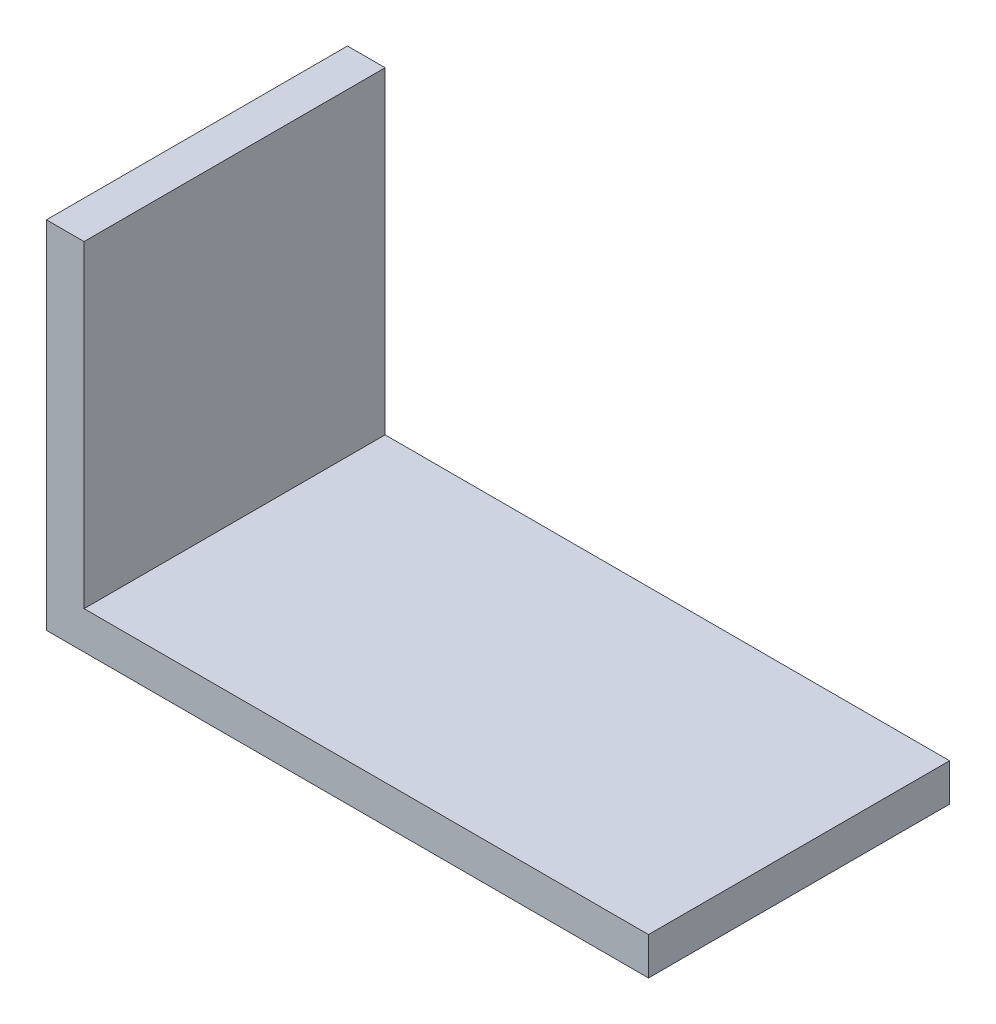
ISO-10303-21;
HEADER;
FILE_DESCRIPTION(('STEP AP214'),'2;1');
FILE_NAME('part.step','',(''),(''),'','','');
FILE_SCHEMA(('AUTOMOTIVE_DESIGN { 1 0 10303 214 1 1 1 1 }'));
ENDSEC;
DATA;
#1=APPLICATION_CONTEXT('core data for automotive mechanical design processes');
#2=APPLICATION_PROTOCOL_DEFINITION('international standard','automotive_design',2000,#1);
#3=PRODUCT_CONTEXT('',#1,'mechanical');
#4=PRODUCT('Part','Part','',(#3));
#5=PRODUCT_RELATED_PRODUCT_CATEGORY('part','',(#4));
#6=PRODUCT_DEFINITION_FORMATION('','',#4);
#7=PRODUCT_DEFINITION_CONTEXT('part definition',#1,'design');
#8=PRODUCT_DEFINITION('design','',#6,#7);
#9=PRODUCT_DEFINITION_SHAPE('','',#8);
#10=(LENGTH_UNIT() NAMED_UNIT(*) SI_UNIT(.MILLI.,.METRE.));
#11=(NAMED_UNIT(*) PLANE_ANGLE_UNIT() SI_UNIT($,.RADIAN.));
#12=(NAMED_UNIT(*) SI_UNIT($,.STERADIAN.) SOLID_ANGLE_UNIT());
#13=UNCERTAINTY_MEASURE_WITH_UNIT(LENGTH_MEASURE(1.E-05),#10,'distance_accuracy_value','');
#14=(GEOMETRIC_REPRESENTATION_CONTEXT(3) GLOBAL_UNCERTAINTY_ASSIGNED_CONTEXT((#13)) GLOBAL_UNIT_ASSIGNED_CONTEXT((#10,
#11,#12)) REPRESENTATION_CONTEXT('',''));
#15=CARTESIAN_POINT('',(0.,0.,0.));
#16=DIRECTION('',(0.,0.,1.));
#17=DIRECTION('',(1.,0.,0.));
#18=AXIS2_PLACEMENT_3D('',#15,#16,#17);
#19=CARTESIAN_POINT('',(0.,0.,25.4));
#20=DIRECTION('',(0.,1.,0.));
#21=DIRECTION('',(0.,0.,1.));
#22=AXIS2_PLACEMENT_3D('',#19,#20,#21);
#23=PLANE('',#22);
#24=DIRECTION('',(1.,0.,0.));
#25=VECTOR('',#24,1.);
#26=CARTESIAN_POINT('',(0.,0.,0.));
#27=LINE('',#26,#25);
#28=CARTESIAN_POINT('',(0.,0.,0.));
#29=VERTEX_POINT('',#28);
#30=CARTESIAN_POINT('',(50.8,0.,0.));
#31=VERTEX_POINT('',#30);
#32=EDGE_CURVE('E116',#29,#31,#27,.T.);
#33=ORIENTED_EDGE('',*,*,#32,.T.);
#34=DIRECTION('',(0.,0.,-1.));
#35=VECTOR('',#34,1.);
#36=CARTESIAN_POINT('',(50.8,0.,25.4));
#37=LINE('',#36,#35);
#38=CARTESIAN_POINT('',(50.8,0.,25.4));
#39=VERTEX_POINT('',#38);
#40=EDGE_CURVE('E11',#39,#31,#37,.T.);
#41=ORIENTED_EDGE('',*,*,#40,.F.);
#42=DIRECTION('',(1.,0.,0.));
#43=VECTOR('',#42,1.);
#44=CARTESIAN_POINT('',(0.,0.,25.4));
#45=LINE('',#44,#43);
#46=CARTESIAN_POINT('',(0.,0.,25.4));
#47=VERTEX_POINT('',#46);
#48=EDGE_CURVE('E126',#47,#39,#45,.T.);
#49=ORIENTED_EDGE('',*,*,#48,.F.);
#50=DIRECTION('',(0.,0.,-1.));
#51=VECTOR('',#50,1.);
#52=CARTESIAN_POINT('',(0.,0.,25.4));
#53=LINE('',#52,#51);
#54=EDGE_CURVE('E112',#47,#29,#53,.T.);
#55=ORIENTED_EDGE('',*,*,#54,.T.);
#56=EDGE_LOOP('',(#33,#41,#49,#55));
#57=FACE_BOUND('',#56,.T.);
#58=ADVANCED_FACE('F32',(#57),#23,.F.);
#59=CARTESIAN_POINT('',(50.8,3.175,25.4));
#60=DIRECTION('',(-1.,0.,0.));
#61=DIRECTION('',(0.,0.,1.));
#62=AXIS2_PLACEMENT_3D('',#59,#60,#61);
#63=PLANE('',#62);
#64=DIRECTION('',(0.,1.,0.));
#65=VECTOR('',#64,1.);
#66=CARTESIAN_POINT('',(50.8,3.175,0.));
#67=LINE('',#66,#65);
#68=CARTESIAN_POINT('',(50.8,3.175,0.));
#69=VERTEX_POINT('',#68);
#70=EDGE_CURVE('E119',#31,#69,#67,.T.);
#71=ORIENTED_EDGE('',*,*,#70,.T.);
#72=DIRECTION('',(0.,0.,-1.));
#73=VECTOR('',#72,1.);
#74=CARTESIAN_POINT('',(50.8,3.175,25.4));
#75=LINE('',#74,#73);
#76=CARTESIAN_POINT('',(50.8,3.175,25.4));
#77=VERTEX_POINT('',#76);
#78=EDGE_CURVE('E40',#77,#69,#75,.T.);
#79=ORIENTED_EDGE('',*,*,#78,.F.);
#80=DIRECTION('',(0.,1.,0.));
#81=VECTOR('',#80,1.);
#82=CARTESIAN_POINT('',(50.8,3.175,25.4));
#83=LINE('',#82,#81);
#84=EDGE_CURVE('E85',#39,#77,#83,.T.);
#85=ORIENTED_EDGE('',*,*,#84,.F.);
#86=ORIENTED_EDGE('',*,*,#40,.T.);
#87=EDGE_LOOP('',(#71,#79,#85,#86));
#88=FACE_BOUND('',#87,.T.);
#89=ADVANCED_FACE('F150',(#88),#63,.F.);
#90=CARTESIAN_POINT('',(3.175,3.175,25.4));
#91=DIRECTION('',(0.,-1.,0.));
#92=DIRECTION('',(0.,0.,-1.));
#93=AXIS2_PLACEMENT_3D('',#90,#91,#92);
#94=PLANE('',#93);
#95=DIRECTION('',(-1.,0.,0.));
#96=VECTOR('',#95,1.);
#97=CARTESIAN_POINT('',(3.175,3.175,0.));
#98=LINE('',#97,#96);
#99=CARTESIAN_POINT('',(3.175,3.175,0.));
#100=VERTEX_POINT('',#99);
#101=EDGE_CURVE('E121',#69,#100,#98,.T.);
#102=ORIENTED_EDGE('',*,*,#101,.T.);
#103=DIRECTION('',(0.,0.,-1.));
#104=VECTOR('',#103,1.);
#105=CARTESIAN_POINT('',(3.175,3.175,25.4));
#106=LINE('',#105,#104);
#107=CARTESIAN_POINT('',(3.175,3.175,25.4));
#108=VERTEX_POINT('',#107);
#109=EDGE_CURVE('E107',#108,#100,#106,.T.);
#110=ORIENTED_EDGE('',*,*,#109,.F.);
#111=DIRECTION('',(-1.,0.,0.));
#112=VECTOR('',#111,1.);
#113=CARTESIAN_POINT('',(3.175,3.175,25.4));
#114=LINE('',#113,#112);
#115=EDGE_CURVE('E98',#77,#108,#114,.T.);
#116=ORIENTED_EDGE('',*,*,#115,.F.);
#117=ORIENTED_EDGE('',*,*,#78,.T.);
#118=EDGE_LOOP('',(#102,#110,#116,#117));
#119=FACE_BOUND('',#118,.T.);
#120=ADVANCED_FACE('F132',(#119),#94,.F.);
#121=CARTESIAN_POINT('',(3.175,3.175,25.4));
#122=DIRECTION('',(-1.,0.,0.));
#123=DIRECTION('',(0.,0.,1.));
#124=AXIS2_PLACEMENT_3D('',#121,#122,#123);
#125=PLANE('',#124);
#126=DIRECTION('',(0.,1.,0.));
#127=VECTOR('',#126,1.);
#128=CARTESIAN_POINT('',(3.175,3.175,0.));
#129=LINE('',#128,#127);
#130=CARTESIAN_POINT('',(3.175,30.,0.));
#131=VERTEX_POINT('',#130);
#132=EDGE_CURVE('E106',#100,#131,#129,.T.);
#133=ORIENTED_EDGE('',*,*,#132,.T.);
#134=DIRECTION('',(0.,0.,-1.));
#135=VECTOR('',#134,1.);
#136=CARTESIAN_POINT('',(3.175,30.,25.4));
#137=LINE('',#136,#135);
#138=CARTESIAN_POINT('',(3.175,30.,25.4));
#139=VERTEX_POINT('',#138);
#140=EDGE_CURVE('E103',#139,#131,#137,.T.);
#141=ORIENTED_EDGE('',*,*,#140,.F.);
#142=DIRECTION('',(0.,1.,0.));
#143=VECTOR('',#142,1.);
#144=CARTESIAN_POINT('',(3.175,3.175,25.4));
#145=LINE('',#144,#143);
#146=EDGE_CURVE('E92',#108,#139,#145,.T.);
#147=ORIENTED_EDGE('',*,*,#146,.F.);
#148=ORIENTED_EDGE('',*,*,#109,.T.);
#149=EDGE_LOOP('',(#133,#141,#147,#148));
#150=FACE_BOUND('',#149,.T.);
#151=ADVANCED_FACE('F104',(#150),#125,.F.);
#152=CARTESIAN_POINT('',(3.175,30.,25.4));
#153=DIRECTION('',(0.,-1.,0.));
#154=DIRECTION('',(0.,0.,-1.));
#155=AXIS2_PLACEMENT_3D('',#152,#153,#154);
#156=PLANE('',#155);
#157=DIRECTION('',(-1.,0.,0.));
#158=VECTOR('',#157,1.);
#159=CARTESIAN_POINT('',(3.175,30.,0.));
#160=LINE('',#159,#158);
#161=CARTESIAN_POINT('',(0.,30.,0.));
#162=VERTEX_POINT('',#161);
#163=EDGE_CURVE('E71',#131,#162,#160,.T.);
#164=ORIENTED_EDGE('',*,*,#163,.T.);
#165=DIRECTION('',(0.,0.,-1.));
#166=VECTOR('',#165,1.);
#167=CARTESIAN_POINT('',(0.,30.,25.4));
#168=LINE('',#167,#166);
#169=CARTESIAN_POINT('',(0.,30.,25.4));
#170=VERTEX_POINT('',#169);
#171=EDGE_CURVE('E108',#170,#162,#168,.T.);
#172=ORIENTED_EDGE('',*,*,#171,.F.);
#173=DIRECTION('',(-1.,0.,0.));
#174=VECTOR('',#173,1.);
#175=CARTESIAN_POINT('',(3.175,30.,25.4));
#176=LINE('',#175,#174);
#177=EDGE_CURVE('E96',#139,#170,#176,.T.);
#178=ORIENTED_EDGE('',*,*,#177,.F.);
#179=ORIENTED_EDGE('',*,*,#140,.T.);
#180=EDGE_LOOP('',(#164,#172,#178,#179));
#181=FACE_BOUND('',#180,.T.);
#182=ADVANCED_FACE('F110',(#181),#156,.F.);
#183=CARTESIAN_POINT('',(0.,0.,25.4));
#184=DIRECTION('',(1.,0.,0.));
#185=DIRECTION('',(0.,0.,-1.));
#186=AXIS2_PLACEMENT_3D('',#183,#184,#185);
#187=PLANE('',#186);
#188=DIRECTION('',(0.,-1.,0.));
#189=VECTOR('',#188,1.);
#190=CARTESIAN_POINT('',(0.,0.,0.));
#191=LINE('',#190,#189);
#192=EDGE_CURVE('E77',#162,#29,#191,.T.);
#193=ORIENTED_EDGE('',*,*,#192,.T.);
#194=ORIENTED_EDGE('',*,*,#54,.F.);
#195=DIRECTION('',(0.,-1.,0.));
#196=VECTOR('',#195,1.);
#197=CARTESIAN_POINT('',(0.,0.,25.4));
#198=LINE('',#197,#196);
#199=EDGE_CURVE('E48',#170,#47,#198,.T.);
#200=ORIENTED_EDGE('',*,*,#199,.F.);
#201=ORIENTED_EDGE('',*,*,#171,.T.);
#202=EDGE_LOOP('',(#193,#194,#200,#201));
#203=FACE_BOUND('',#202,.T.);
#204=ADVANCED_FACE('F139',(#203),#187,.F.);
#205=CARTESIAN_POINT('',(50.8,0.,25.4));
#206=DIRECTION('',(0.,0.,-1.));
#207=DIRECTION('',(-1.,0.,0.));
#208=AXIS2_PLACEMENT_3D('',#205,#206,#207);
#209=PLANE('',#208);
#210=ORIENTED_EDGE('',*,*,#48,.T.);
#211=ORIENTED_EDGE('',*,*,#84,.T.);
#212=ORIENTED_EDGE('',*,*,#115,.T.);
#213=ORIENTED_EDGE('',*,*,#146,.T.);
#214=ORIENTED_EDGE('',*,*,#177,.T.);
#215=ORIENTED_EDGE('',*,*,#199,.T.);
#216=EDGE_LOOP('',(#210,#211,#212,#213,#214,#215));
#217=FACE_BOUND('',#216,.T.);
#218=ADVANCED_FACE('F94',(#217),#209,.F.);
#219=CARTESIAN_POINT('',(50.8,0.,0.));
#220=DIRECTION('',(0.,0.,-1.));
#221=DIRECTION('',(-1.,0.,0.));
#222=AXIS2_PLACEMENT_3D('',#219,#220,#221);
#223=PLANE('',#222);
#224=ORIENTED_EDGE('',*,*,#32,.F.);
#225=ORIENTED_EDGE('',*,*,#192,.F.);
#226=ORIENTED_EDGE('',*,*,#163,.F.);
#227=ORIENTED_EDGE('',*,*,#132,.F.);
#228=ORIENTED_EDGE('',*,*,#101,.F.);
#229=ORIENTED_EDGE('',*,*,#70,.F.);
#230=EDGE_LOOP('',(#224,#225,#226,#227,#228,#229));
#231=FACE_BOUND('',#230,.T.);
#232=ADVANCED_FACE('F135',(#231),#223,.T.);
#233=CLOSED_SHELL('',(#58,#89,#120,#151,#182,#204,#218,#232));
#234=MANIFOLD_SOLID_BREP('B2',#233);
#235=ADVANCED_BREP_SHAPE_REPRESENTATION('',(#18,#234),#14);
#236=SHAPE_DEFINITION_REPRESENTATION(#9,#235);
ENDSEC;
END-ISO-10303-21;
